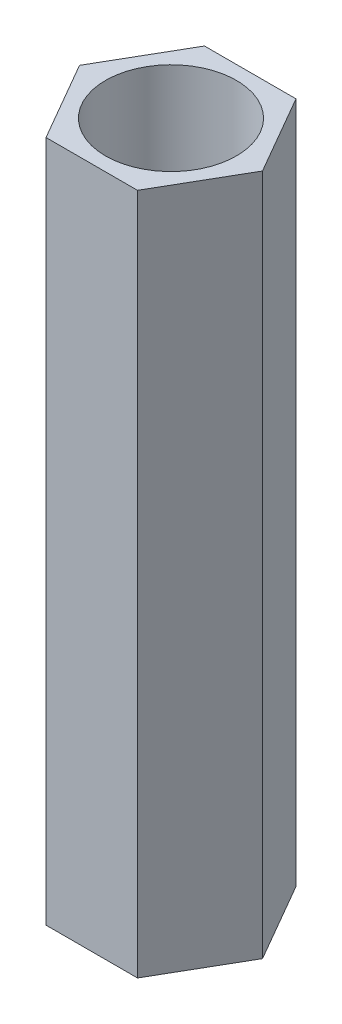
ISO-10303-21;
HEADER;
FILE_DESCRIPTION(('STEP AP214'),'2;1');
FILE_NAME('part.step','',(''),(''),'','','');
FILE_SCHEMA(('AUTOMOTIVE_DESIGN { 1 0 10303 214 1 1 1 1 }'));
ENDSEC;
DATA;
#1=APPLICATION_CONTEXT('core data for automotive mechanical design processes');
#2=APPLICATION_PROTOCOL_DEFINITION('international standard','automotive_design',2000,#1);
#3=PRODUCT_CONTEXT('',#1,'mechanical');
#4=PRODUCT('Part','Part','',(#3));
#5=PRODUCT_RELATED_PRODUCT_CATEGORY('part','',(#4));
#6=PRODUCT_DEFINITION_FORMATION('','',#4);
#7=PRODUCT_DEFINITION_CONTEXT('part definition',#1,'design');
#8=PRODUCT_DEFINITION('design','',#6,#7);
#9=PRODUCT_DEFINITION_SHAPE('','',#8);
#10=(LENGTH_UNIT() NAMED_UNIT(*) SI_UNIT(.MILLI.,.METRE.));
#11=(NAMED_UNIT(*) PLANE_ANGLE_UNIT() SI_UNIT($,.RADIAN.));
#12=(NAMED_UNIT(*) SI_UNIT($,.STERADIAN.) SOLID_ANGLE_UNIT());
#13=UNCERTAINTY_MEASURE_WITH_UNIT(LENGTH_MEASURE(1.E-05),#10,'distance_accuracy_value','');
#14=(GEOMETRIC_REPRESENTATION_CONTEXT(3) GLOBAL_UNCERTAINTY_ASSIGNED_CONTEXT((#13)) GLOBAL_UNIT_ASSIGNED_CONTEXT((#10,
#11,#12)) REPRESENTATION_CONTEXT('',''));
#15=CARTESIAN_POINT('',(0.,0.,0.));
#16=DIRECTION('',(0.,0.,1.));
#17=DIRECTION('',(1.,0.,0.));
#18=AXIS2_PLACEMENT_3D('',#15,#16,#17);
#19=CARTESIAN_POINT('',(-0.843220068151449,12.573,-1.4605));
#20=DIRECTION('',(0.866025403784438,0.,0.5));
#21=DIRECTION('',(0.5,0.,-0.866025403784438));
#22=AXIS2_PLACEMENT_3D('',#19,#20,#21);
#23=PLANE('',#22);
#24=DIRECTION('',(-0.5,0.,0.866025403784438));
#25=VECTOR('',#24,1.);
#26=CARTESIAN_POINT('',(-0.843220068151449,0.,-1.4605));
#27=LINE('',#26,#25);
#28=CARTESIAN_POINT('',(-0.843220068151449,0.,-1.4605));
#29=VERTEX_POINT('',#28);
#30=CARTESIAN_POINT('',(-1.6864401363029,0.,0.));
#31=VERTEX_POINT('',#30);
#32=EDGE_CURVE('E116',#29,#31,#27,.T.);
#33=ORIENTED_EDGE('',*,*,#32,.T.);
#34=DIRECTION('',(0.,-1.,0.));
#35=VECTOR('',#34,1.);
#36=CARTESIAN_POINT('',(-1.6864401363029,12.573,0.));
#37=LINE('',#36,#35);
#38=CARTESIAN_POINT('',(-1.6864401363029,12.573,0.));
#39=VERTEX_POINT('',#38);
#40=EDGE_CURVE('E11',#39,#31,#37,.T.);
#41=ORIENTED_EDGE('',*,*,#40,.F.);
#42=DIRECTION('',(-0.5,0.,0.866025403784438));
#43=VECTOR('',#42,1.);
#44=CARTESIAN_POINT('',(-0.843220068151449,12.573,-1.4605));
#45=LINE('',#44,#43);
#46=CARTESIAN_POINT('',(-0.843220068151449,12.573,-1.4605));
#47=VERTEX_POINT('',#46);
#48=EDGE_CURVE('E127',#47,#39,#45,.T.);
#49=ORIENTED_EDGE('',*,*,#48,.F.);
#50=DIRECTION('',(0.,-1.,0.));
#51=VECTOR('',#50,1.);
#52=CARTESIAN_POINT('',(-0.843220068151449,12.573,-1.4605));
#53=LINE('',#52,#51);
#54=EDGE_CURVE('E112',#47,#29,#53,.T.);
#55=ORIENTED_EDGE('',*,*,#54,.T.);
#56=EDGE_LOOP('',(#33,#41,#49,#55));
#57=FACE_BOUND('',#56,.T.);
#58=ADVANCED_FACE('F32',(#57),#23,.F.);
#59=CARTESIAN_POINT('',(-1.6864401363029,12.573,0.));
#60=DIRECTION('',(0.866025403784439,0.,-0.5));
#61=DIRECTION('',(-0.5,0.,-0.866025403784439));
#62=AXIS2_PLACEMENT_3D('',#59,#60,#61);
#63=PLANE('',#62);
#64=DIRECTION('',(0.5,0.,0.866025403784439));
#65=VECTOR('',#64,1.);
#66=CARTESIAN_POINT('',(-1.6864401363029,0.,0.));
#67=LINE('',#66,#65);
#68=CARTESIAN_POINT('',(-0.843220068151451,0.,1.4605));
#69=VERTEX_POINT('',#68);
#70=EDGE_CURVE('E119',#31,#69,#67,.T.);
#71=ORIENTED_EDGE('',*,*,#70,.T.);
#72=DIRECTION('',(0.,-1.,0.));
#73=VECTOR('',#72,1.);
#74=CARTESIAN_POINT('',(-0.843220068151451,12.573,1.4605));
#75=LINE('',#74,#73);
#76=CARTESIAN_POINT('',(-0.843220068151451,12.573,1.4605));
#77=VERTEX_POINT('',#76);
#78=EDGE_CURVE('E40',#77,#69,#75,.T.);
#79=ORIENTED_EDGE('',*,*,#78,.F.);
#80=DIRECTION('',(0.5,0.,0.866025403784439));
#81=VECTOR('',#80,1.);
#82=CARTESIAN_POINT('',(-1.6864401363029,12.573,0.));
#83=LINE('',#82,#81);
#84=EDGE_CURVE('E85',#39,#77,#83,.T.);
#85=ORIENTED_EDGE('',*,*,#84,.F.);
#86=ORIENTED_EDGE('',*,*,#40,.T.);
#87=EDGE_LOOP('',(#71,#79,#85,#86));
#88=FACE_BOUND('',#87,.T.);
#89=ADVANCED_FACE('F152',(#88),#63,.F.);
#90=CARTESIAN_POINT('',(-0.843220068151451,12.573,1.4605));
#91=DIRECTION('',(0.,0.,-1.));
#92=DIRECTION('',(-1.,0.,0.));
#93=AXIS2_PLACEMENT_3D('',#90,#91,#92);
#94=PLANE('',#93);
#95=DIRECTION('',(1.,0.,0.));
#96=VECTOR('',#95,1.);
#97=CARTESIAN_POINT('',(-0.843220068151451,0.,1.4605));
#98=LINE('',#97,#96);
#99=CARTESIAN_POINT('',(0.843220068151447,0.,1.4605));
#100=VERTEX_POINT('',#99);
#101=EDGE_CURVE('E122',#69,#100,#98,.T.);
#102=ORIENTED_EDGE('',*,*,#101,.T.);
#103=DIRECTION('',(0.,-1.,0.));
#104=VECTOR('',#103,1.);
#105=CARTESIAN_POINT('',(0.843220068151447,12.573,1.4605));
#106=LINE('',#105,#104);
#107=CARTESIAN_POINT('',(0.843220068151447,12.573,1.4605));
#108=VERTEX_POINT('',#107);
#109=EDGE_CURVE('E107',#108,#100,#106,.T.);
#110=ORIENTED_EDGE('',*,*,#109,.F.);
#111=DIRECTION('',(1.,0.,0.));
#112=VECTOR('',#111,1.);
#113=CARTESIAN_POINT('',(-0.843220068151451,12.573,1.4605));
#114=LINE('',#113,#112);
#115=EDGE_CURVE('E98',#77,#108,#114,.T.);
#116=ORIENTED_EDGE('',*,*,#115,.F.);
#117=ORIENTED_EDGE('',*,*,#78,.T.);
#118=EDGE_LOOP('',(#102,#110,#116,#117));
#119=FACE_BOUND('',#118,.T.);
#120=ADVANCED_FACE('F133',(#119),#94,.F.);
#121=CARTESIAN_POINT('',(0.843220068151447,12.573,1.4605));
#122=DIRECTION('',(-0.866025403784439,0.,-0.5));
#123=DIRECTION('',(-0.5,0.,0.866025403784439));
#124=AXIS2_PLACEMENT_3D('',#121,#122,#123);
#125=PLANE('',#124);
#126=DIRECTION('',(0.5,0.,-0.866025403784439));
#127=VECTOR('',#126,1.);
#128=CARTESIAN_POINT('',(0.843220068151447,0.,1.4605));
#129=LINE('',#128,#127);
#130=CARTESIAN_POINT('',(1.6864401363029,0.,0.));
#131=VERTEX_POINT('',#130);
#132=EDGE_CURVE('E106',#100,#131,#129,.T.);
#133=ORIENTED_EDGE('',*,*,#132,.T.);
#134=DIRECTION('',(0.,-1.,0.));
#135=VECTOR('',#134,1.);
#136=CARTESIAN_POINT('',(1.6864401363029,12.573,0.));
#137=LINE('',#136,#135);
#138=CARTESIAN_POINT('',(1.6864401363029,12.573,0.));
#139=VERTEX_POINT('',#138);
#140=EDGE_CURVE('E103',#139,#131,#137,.T.);
#141=ORIENTED_EDGE('',*,*,#140,.F.);
#142=DIRECTION('',(0.5,0.,-0.866025403784439));
#143=VECTOR('',#142,1.);
#144=CARTESIAN_POINT('',(0.843220068151447,12.573,1.4605));
#145=LINE('',#144,#143);
#146=EDGE_CURVE('E92',#108,#139,#145,.T.);
#147=ORIENTED_EDGE('',*,*,#146,.F.);
#148=ORIENTED_EDGE('',*,*,#109,.T.);
#149=EDGE_LOOP('',(#133,#141,#147,#148));
#150=FACE_BOUND('',#149,.T.);
#151=ADVANCED_FACE('F104',(#150),#125,.F.);
#152=CARTESIAN_POINT('',(1.6864401363029,12.573,0.));
#153=DIRECTION('',(-0.866025403784439,0.,0.5));
#154=DIRECTION('',(0.5,0.,0.866025403784439));
#155=AXIS2_PLACEMENT_3D('',#152,#153,#154);
#156=PLANE('',#155);
#157=DIRECTION('',(-0.5,0.,-0.866025403784439));
#158=VECTOR('',#157,1.);
#159=CARTESIAN_POINT('',(1.6864401363029,0.,0.));
#160=LINE('',#159,#158);
#161=CARTESIAN_POINT('',(0.84322006815145,0.,-1.4605));
#162=VERTEX_POINT('',#161);
#163=EDGE_CURVE('E71',#131,#162,#160,.T.);
#164=ORIENTED_EDGE('',*,*,#163,.T.);
#165=DIRECTION('',(0.,-1.,0.));
#166=VECTOR('',#165,1.);
#167=CARTESIAN_POINT('',(0.84322006815145,12.573,-1.4605));
#168=LINE('',#167,#166);
#169=CARTESIAN_POINT('',(0.84322006815145,12.573,-1.4605));
#170=VERTEX_POINT('',#169);
#171=EDGE_CURVE('E108',#170,#162,#168,.T.);
#172=ORIENTED_EDGE('',*,*,#171,.F.);
#173=DIRECTION('',(-0.5,0.,-0.866025403784439));
#174=VECTOR('',#173,1.);
#175=CARTESIAN_POINT('',(1.6864401363029,12.573,0.));
#176=LINE('',#175,#174);
#177=EDGE_CURVE('E96',#139,#170,#176,.T.);
#178=ORIENTED_EDGE('',*,*,#177,.F.);
#179=ORIENTED_EDGE('',*,*,#140,.T.);
#180=EDGE_LOOP('',(#164,#172,#178,#179));
#181=FACE_BOUND('',#180,.T.);
#182=ADVANCED_FACE('F110',(#181),#156,.F.);
#183=CARTESIAN_POINT('',(0.84322006815145,12.573,-1.4605));
#184=DIRECTION('',(0.,0.,1.));
#185=DIRECTION('',(1.,0.,0.));
#186=AXIS2_PLACEMENT_3D('',#183,#184,#185);
#187=PLANE('',#186);
#188=DIRECTION('',(-1.,0.,0.));
#189=VECTOR('',#188,1.);
#190=CARTESIAN_POINT('',(0.84322006815145,0.,-1.4605));
#191=LINE('',#190,#189);
#192=EDGE_CURVE('E77',#162,#29,#191,.T.);
#193=ORIENTED_EDGE('',*,*,#192,.T.);
#194=ORIENTED_EDGE('',*,*,#54,.F.);
#195=DIRECTION('',(-1.,0.,0.));
#196=VECTOR('',#195,1.);
#197=CARTESIAN_POINT('',(0.84322006815145,12.573,-1.4605));
#198=LINE('',#197,#196);
#199=EDGE_CURVE('E48',#170,#47,#198,.T.);
#200=ORIENTED_EDGE('',*,*,#199,.F.);
#201=ORIENTED_EDGE('',*,*,#171,.T.);
#202=EDGE_LOOP('',(#193,#194,#200,#201));
#203=FACE_BOUND('',#202,.T.);
#204=ADVANCED_FACE('F140',(#203),#187,.F.);
#205=CARTESIAN_POINT('',(0.,12.573,0.));
#206=DIRECTION('',(0.,1.,0.));
#207=DIRECTION('',(0.,0.,1.));
#208=AXIS2_PLACEMENT_3D('',#205,#206,#207);
#209=PLANE('',#208);
#210=CARTESIAN_POINT('',(0.,12.573,0.));
#211=DIRECTION('',(0.,1.,0.));
#212=DIRECTION('',(0.,0.,1.));
#213=AXIS2_PLACEMENT_3D('',#210,#211,#212);
#214=CIRCLE('',#213,1.2065);
#215=CARTESIAN_POINT('',(0.,12.573,1.2065));
#216=VERTEX_POINT('',#215);
#217=EDGE_CURVE('E207',#216,#216,#214,.T.);
#218=ORIENTED_EDGE('',*,*,#217,.F.);
#219=EDGE_LOOP('',(#218));
#220=FACE_BOUND('',#219,.T.);
#221=ORIENTED_EDGE('',*,*,#48,.T.);
#222=ORIENTED_EDGE('',*,*,#84,.T.);
#223=ORIENTED_EDGE('',*,*,#115,.T.);
#224=ORIENTED_EDGE('',*,*,#146,.T.);
#225=ORIENTED_EDGE('',*,*,#177,.T.);
#226=ORIENTED_EDGE('',*,*,#199,.T.);
#227=EDGE_LOOP('',(#221,#222,#223,#224,#225,#226));
#228=FACE_BOUND('',#227,.T.);
#229=ADVANCED_FACE('F94',(#220,#228),#209,.T.);
#230=CARTESIAN_POINT('',(0.,0.,0.));
#231=DIRECTION('',(0.,1.,0.));
#232=DIRECTION('',(0.,0.,1.));
#233=AXIS2_PLACEMENT_3D('',#230,#231,#232);
#234=PLANE('',#233);
#235=CARTESIAN_POINT('',(0.,0.,0.));
#236=DIRECTION('',(0.,1.,0.));
#237=DIRECTION('',(0.,0.,1.));
#238=AXIS2_PLACEMENT_3D('',#235,#236,#237);
#239=CIRCLE('',#238,1.2065);
#240=CARTESIAN_POINT('',(0.,0.,1.2065));
#241=VERTEX_POINT('',#240);
#242=EDGE_CURVE('E120',#241,#241,#239,.T.);
#243=ORIENTED_EDGE('',*,*,#242,.T.);
#244=EDGE_LOOP('',(#243));
#245=FACE_BOUND('',#244,.T.);
#246=ORIENTED_EDGE('',*,*,#32,.F.);
#247=ORIENTED_EDGE('',*,*,#192,.F.);
#248=ORIENTED_EDGE('',*,*,#163,.F.);
#249=ORIENTED_EDGE('',*,*,#132,.F.);
#250=ORIENTED_EDGE('',*,*,#101,.F.);
#251=ORIENTED_EDGE('',*,*,#70,.F.);
#252=EDGE_LOOP('',(#246,#247,#248,#249,#250,#251));
#253=FACE_BOUND('',#252,.T.);
#254=ADVANCED_FACE('F136',(#245,#253),#234,.F.);
#255=CARTESIAN_POINT('',(0.,0.,0.));
#256=DIRECTION('',(0.,1.,0.));
#257=DIRECTION('',(0.,0.,1.));
#258=AXIS2_PLACEMENT_3D('',#255,#256,#257);
#259=CYLINDRICAL_SURFACE('',#258,1.2065);
#260=ORIENTED_EDGE('',*,*,#242,.F.);
#261=EDGE_LOOP('',(#260));
#262=FACE_BOUND('',#261,.T.);
#263=ORIENTED_EDGE('',*,*,#217,.T.);
#264=EDGE_LOOP('',(#263));
#265=FACE_BOUND('',#264,.T.);
#266=ADVANCED_FACE('F189',(#262,#265),#259,.F.);
#267=CLOSED_SHELL('',(#58,#89,#120,#151,#182,#204,#229,#254,#266));
#268=MANIFOLD_SOLID_BREP('B2',#267);
#269=ADVANCED_BREP_SHAPE_REPRESENTATION('',(#18,#268),#14);
#270=SHAPE_DEFINITION_REPRESENTATION(#9,#269);
ENDSEC;
END-ISO-10303-21;
